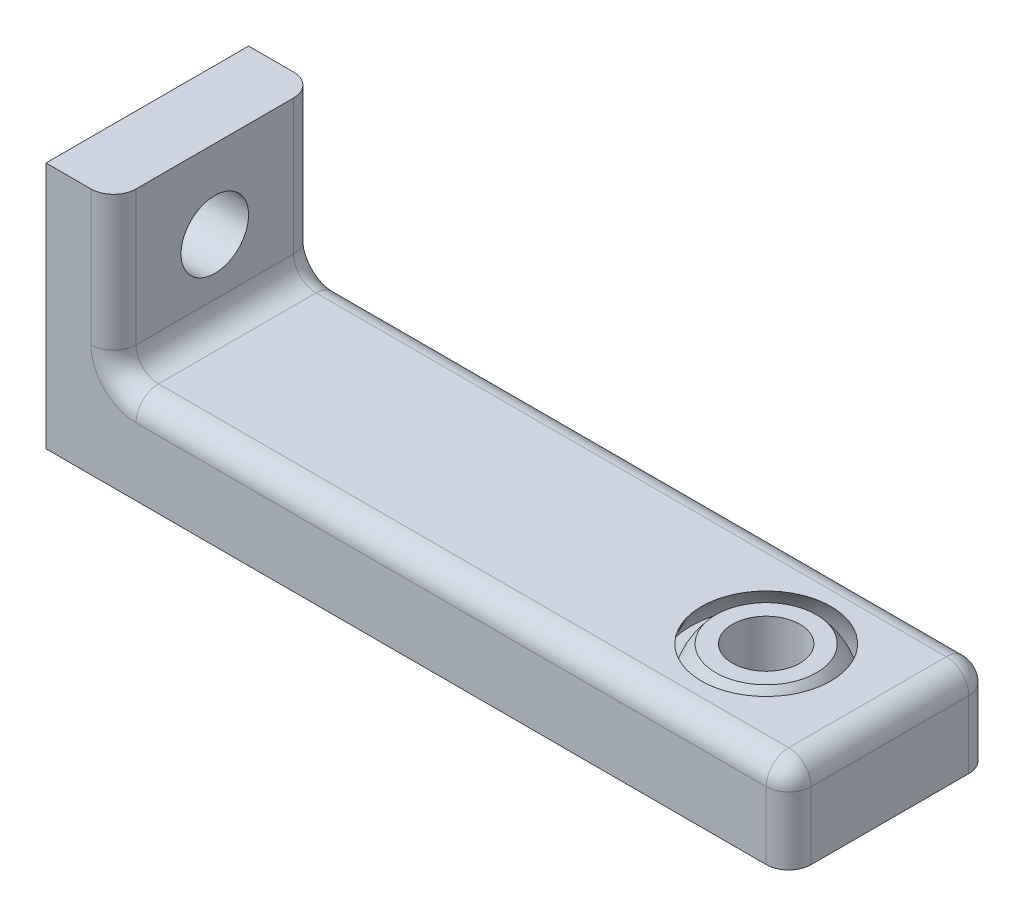
ISO-10303-21;
HEADER;
FILE_DESCRIPTION(('STEP AP214'),'2;1');
FILE_NAME('part.step','',(''),(''),'','','');
FILE_SCHEMA(('AUTOMOTIVE_DESIGN { 1 0 10303 214 1 1 1 1 }'));
ENDSEC;
DATA;
#1=APPLICATION_CONTEXT('core data for automotive mechanical design processes');
#2=APPLICATION_PROTOCOL_DEFINITION('international standard','automotive_design',2000,#1);
#3=PRODUCT_CONTEXT('',#1,'mechanical');
#4=PRODUCT('Part','Part','',(#3));
#5=PRODUCT_RELATED_PRODUCT_CATEGORY('part','',(#4));
#6=PRODUCT_DEFINITION_FORMATION('','',#4);
#7=PRODUCT_DEFINITION_CONTEXT('part definition',#1,'design');
#8=PRODUCT_DEFINITION('design','',#6,#7);
#9=PRODUCT_DEFINITION_SHAPE('','',#8);
#10=(LENGTH_UNIT() NAMED_UNIT(*) SI_UNIT(.MILLI.,.METRE.));
#11=(NAMED_UNIT(*) PLANE_ANGLE_UNIT() SI_UNIT($,.RADIAN.));
#12=(NAMED_UNIT(*) SI_UNIT($,.STERADIAN.) SOLID_ANGLE_UNIT());
#13=UNCERTAINTY_MEASURE_WITH_UNIT(LENGTH_MEASURE(1.E-05),#10,'distance_accuracy_value','');
#14=(GEOMETRIC_REPRESENTATION_CONTEXT(3) GLOBAL_UNCERTAINTY_ASSIGNED_CONTEXT((#13)) GLOBAL_UNIT_ASSIGNED_CONTEXT((#10,
#11,#12)) REPRESENTATION_CONTEXT('',''));
#15=CARTESIAN_POINT('',(0.,0.,0.));
#16=DIRECTION('',(0.,0.,1.));
#17=DIRECTION('',(1.,0.,0.));
#18=AXIS2_PLACEMENT_3D('',#15,#16,#17);
#19=CARTESIAN_POINT('',(-3.,0.,0.));
#20=DIRECTION('',(0.,0.,-1.));
#21=DIRECTION('',(1.,0.,0.));
#22=AXIS2_PLACEMENT_3D('',#19,#20,#21);
#23=SPHERICAL_SURFACE('',#22,3.);
#24=CARTESIAN_POINT('',(-3.,0.,0.));
#25=DIRECTION('',(0.,1.,0.));
#26=DIRECTION('',(0.,0.,1.));
#27=AXIS2_PLACEMENT_3D('',#24,#25,#26);
#28=SPHERICAL_SURFACE('',#27,3.);
#29=CARTESIAN_POINT('',(-3.,-2.,0.));
#30=DIRECTION('',(0.,1.,0.));
#31=DIRECTION('',(0.,0.,1.));
#32=AXIS2_PLACEMENT_3D('',#29,#30,#31);
#33=CIRCLE('',#32,2.23606797749979);
#34=CARTESIAN_POINT('',(-3.,-2.,2.23606797749979));
#35=VERTEX_POINT('',#34);
#36=EDGE_CURVE('E57',#35,#35,#33,.F.);
#37=ORIENTED_EDGE('',*,*,#36,.F.);
#38=EDGE_LOOP('',(#37));
#39=FACE_BOUND('',#38,.T.);
#40=CARTESIAN_POINT('',(-3.,2.,0.));
#41=DIRECTION('',(0.,-1.,0.));
#42=DIRECTION('',(0.,0.,-1.));
#43=AXIS2_PLACEMENT_3D('',#40,#41,#42);
#44=CIRCLE('',#43,2.23606797749979);
#45=CARTESIAN_POINT('',(-3.,2.,-2.23606797749979));
#46=VERTEX_POINT('',#45);
#47=EDGE_CURVE('E11',#46,#46,#44,.F.);
#48=ORIENTED_EDGE('',*,*,#47,.F.);
#49=EDGE_LOOP('',(#48));
#50=FACE_BOUND('',#49,.T.);
#51=ADVANCED_FACE('F45',(#39,#50),#28,.T.);
#52=CARTESIAN_POINT('',(-3.,10.,0.));
#53=DIRECTION('',(0.,-1.,0.));
#54=DIRECTION('',(0.,0.,-1.));
#55=AXIS2_PLACEMENT_3D('',#52,#53,#54);
#56=CYLINDRICAL_SURFACE('',#55,1.5);
#57=CARTESIAN_POINT('',(-3.,-2.,0.));
#58=DIRECTION('',(0.,1.,0.));
#59=DIRECTION('',(0.,0.,1.));
#60=AXIS2_PLACEMENT_3D('',#57,#58,#59);
#61=CIRCLE('',#60,1.5);
#62=CARTESIAN_POINT('',(-3.,-2.,1.5));
#63=VERTEX_POINT('',#62);
#64=EDGE_CURVE('E48',#63,#63,#61,.T.);
#65=ORIENTED_EDGE('',*,*,#64,.F.);
#66=EDGE_LOOP('',(#65));
#67=FACE_BOUND('',#66,.T.);
#68=CARTESIAN_POINT('',(-3.,2.,0.));
#69=DIRECTION('',(0.,-1.,0.));
#70=DIRECTION('',(0.,0.,-1.));
#71=AXIS2_PLACEMENT_3D('',#68,#69,#70);
#72=CIRCLE('',#71,1.5);
#73=CARTESIAN_POINT('',(-3.,2.,-1.5));
#74=VERTEX_POINT('',#73);
#75=EDGE_CURVE('E52',#74,#74,#72,.T.);
#76=ORIENTED_EDGE('',*,*,#75,.F.);
#77=EDGE_LOOP('',(#76));
#78=FACE_BOUND('',#77,.T.);
#79=ADVANCED_FACE('F67',(#67,#78),#56,.F.);
#80=CARTESIAN_POINT('',(15.5,2.,-4.5));
#81=DIRECTION('',(0.,-1.,0.));
#82=DIRECTION('',(0.,0.,-1.));
#83=AXIS2_PLACEMENT_3D('',#80,#81,#82);
#84=PLANE('',#83);
#85=ORIENTED_EDGE('',*,*,#47,.T.);
#86=EDGE_LOOP('',(#85));
#87=FACE_BOUND('',#86,.T.);
#88=ORIENTED_EDGE('',*,*,#75,.T.);
#89=EDGE_LOOP('',(#88));
#90=FACE_BOUND('',#89,.T.);
#91=ADVANCED_FACE('F70',(#87,#90),#84,.F.);
#92=CARTESIAN_POINT('',(15.5,-2.,-4.5));
#93=DIRECTION('',(0.,1.,0.));
#94=DIRECTION('',(0.,0.,1.));
#95=AXIS2_PLACEMENT_3D('',#92,#93,#94);
#96=PLANE('',#95);
#97=ORIENTED_EDGE('',*,*,#36,.T.);
#98=EDGE_LOOP('',(#97));
#99=FACE_BOUND('',#98,.T.);
#100=ORIENTED_EDGE('',*,*,#64,.T.);
#101=EDGE_LOOP('',(#100));
#102=FACE_BOUND('',#101,.T.);
#103=ADVANCED_FACE('F65',(#99,#102),#96,.F.);
#104=CLOSED_SHELL('',(#51,#79,#91,#103));
#105=MANIFOLD_SOLID_BREP('B2',#104);
#106=CARTESIAN_POINT('',(0.,2.,0.));
#107=DIRECTION('',(0.,-1.,0.));
#108=DIRECTION('',(0.,0.,-1.));
#109=AXIS2_PLACEMENT_3D('',#106,#107,#108);
#110=PLANE('',#109);
#111=CARTESIAN_POINT('',(-3.,2.,0.));
#112=DIRECTION('',(0.,-1.,0.));
#113=DIRECTION('',(0.,0.,-1.));
#114=AXIS2_PLACEMENT_3D('',#111,#112,#113);
#115=CIRCLE('',#114,2.87228132326901);
#116=CARTESIAN_POINT('',(-3.,2.,-2.87228132326901));
#117=VERTEX_POINT('',#116);
#118=EDGE_CURVE('E324',#117,#117,#115,.T.);
#119=ORIENTED_EDGE('',*,*,#118,.T.);
#120=EDGE_LOOP('',(#119));
#121=FACE_BOUND('',#120,.T.);
#122=DIRECTION('',(0.,0.,-1.));
#123=VECTOR('',#122,1.);
#124=CARTESIAN_POINT('',(-26.5,2.,4.5));
#125=LINE('',#124,#123);
#126=CARTESIAN_POINT('',(-26.5,2.,-3.5));
#127=VERTEX_POINT('',#126);
#128=CARTESIAN_POINT('',(-26.5,2.,3.5));
#129=VERTEX_POINT('',#128);
#130=EDGE_CURVE('E388',#127,#129,#125,.F.);
#131=ORIENTED_EDGE('',*,*,#130,.T.);
#132=DIRECTION('',(1.,0.,0.));
#133=VECTOR('',#132,1.);
#134=CARTESIAN_POINT('',(1.5,2.,3.5));
#135=LINE('',#134,#133);
#136=CARTESIAN_POINT('',(1.5,2.,3.5));
#137=VERTEX_POINT('',#136);
#138=EDGE_CURVE('E413',#129,#137,#135,.T.);
#139=ORIENTED_EDGE('',*,*,#138,.T.);
#140=DIRECTION('',(0.,0.,-1.));
#141=VECTOR('',#140,1.);
#142=CARTESIAN_POINT('',(1.5,2.,-3.5));
#143=LINE('',#142,#141);
#144=CARTESIAN_POINT('',(1.5,2.,-3.5));
#145=VERTEX_POINT('',#144);
#146=EDGE_CURVE('E411',#137,#145,#143,.T.);
#147=ORIENTED_EDGE('',*,*,#146,.T.);
#148=DIRECTION('',(-1.,0.,0.));
#149=VECTOR('',#148,1.);
#150=CARTESIAN_POINT('',(-26.5,2.,-3.5));
#151=LINE('',#150,#149);
#152=EDGE_CURVE('E409',#145,#127,#151,.T.);
#153=ORIENTED_EDGE('',*,*,#152,.T.);
#154=EDGE_LOOP('',(#131,#139,#147,#153));
#155=FACE_BOUND('',#154,.T.);
#156=ADVANCED_FACE('F107',(#121,#155),#110,.F.);
#157=CARTESIAN_POINT('',(0.,-2.,0.));
#158=DIRECTION('',(0.,-1.,0.));
#159=DIRECTION('',(0.,0.,-1.));
#160=AXIS2_PLACEMENT_3D('',#157,#158,#159);
#161=PLANE('',#160);
#162=CARTESIAN_POINT('',(-3.,-2.,0.));
#163=DIRECTION('',(0.,-1.,0.));
#164=DIRECTION('',(0.,0.,-1.));
#165=AXIS2_PLACEMENT_3D('',#162,#163,#164);
#166=CIRCLE('',#165,2.87228132326901);
#167=CARTESIAN_POINT('',(-3.,-2.,-2.87228132326901));
#168=VERTEX_POINT('',#167);
#169=EDGE_CURVE('E337',#168,#168,#166,.T.);
#170=ORIENTED_EDGE('',*,*,#169,.F.);
#171=EDGE_LOOP('',(#170));
#172=FACE_BOUND('',#171,.T.);
#173=DIRECTION('',(0.,0.,-1.));
#174=VECTOR('',#173,1.);
#175=CARTESIAN_POINT('',(2.5,-2.,-4.5));
#176=LINE('',#175,#174);
#177=CARTESIAN_POINT('',(2.5,-2.,3.5));
#178=VERTEX_POINT('',#177);
#179=CARTESIAN_POINT('',(2.5,-2.,-3.5));
#180=VERTEX_POINT('',#179);
#181=EDGE_CURVE('E340',#178,#180,#176,.T.);
#182=ORIENTED_EDGE('',*,*,#181,.F.);
#183=CARTESIAN_POINT('',(1.5,-2.,3.5));
#184=DIRECTION('',(0.,-1.,0.));
#185=DIRECTION('',(0.,0.,-1.));
#186=AXIS2_PLACEMENT_3D('',#183,#184,#185);
#187=CIRCLE('',#186,1.);
#188=CARTESIAN_POINT('',(1.5,-2.,4.5));
#189=VERTEX_POINT('',#188);
#190=EDGE_CURVE('E383',#178,#189,#187,.T.);
#191=ORIENTED_EDGE('',*,*,#190,.T.);
#192=DIRECTION('',(1.,0.,0.));
#193=VECTOR('',#192,1.);
#194=CARTESIAN_POINT('',(2.5,-2.,4.5));
#195=LINE('',#194,#193);
#196=CARTESIAN_POINT('',(-30.5,-2.,4.5));
#197=VERTEX_POINT('',#196);
#198=EDGE_CURVE('E345',#197,#189,#195,.T.);
#199=ORIENTED_EDGE('',*,*,#198,.F.);
#200=DIRECTION('',(0.,0.,1.));
#201=VECTOR('',#200,1.);
#202=CARTESIAN_POINT('',(-30.5,-2.,-4.5));
#203=LINE('',#202,#201);
#204=CARTESIAN_POINT('',(-30.5,-2.,-4.5));
#205=VERTEX_POINT('',#204);
#206=EDGE_CURVE('E268',#205,#197,#203,.T.);
#207=ORIENTED_EDGE('',*,*,#206,.F.);
#208=DIRECTION('',(-1.,0.,0.));
#209=VECTOR('',#208,1.);
#210=CARTESIAN_POINT('',(2.5,-2.,-4.5));
#211=LINE('',#210,#209);
#212=CARTESIAN_POINT('',(1.5,-2.,-4.5));
#213=VERTEX_POINT('',#212);
#214=EDGE_CURVE('E342',#213,#205,#211,.T.);
#215=ORIENTED_EDGE('',*,*,#214,.F.);
#216=CARTESIAN_POINT('',(1.5,-2.,-3.5));
#217=DIRECTION('',(0.,-1.,0.));
#218=DIRECTION('',(0.,0.,-1.));
#219=AXIS2_PLACEMENT_3D('',#216,#217,#218);
#220=CIRCLE('',#219,1.);
#221=EDGE_CURVE('E375',#213,#180,#220,.T.);
#222=ORIENTED_EDGE('',*,*,#221,.T.);
#223=EDGE_LOOP('',(#182,#191,#199,#207,#215,#222));
#224=FACE_BOUND('',#223,.T.);
#225=ADVANCED_FACE('F506',(#172,#224),#161,.T.);
#226=CARTESIAN_POINT('',(2.5,-2.,-4.5));
#227=DIRECTION('',(1.,0.,0.));
#228=DIRECTION('',(0.,0.,-1.));
#229=AXIS2_PLACEMENT_3D('',#226,#227,#228);
#230=PLANE('',#229);
#231=DIRECTION('',(0.,1.,0.));
#232=VECTOR('',#231,1.);
#233=CARTESIAN_POINT('',(2.5,-2.,-3.5));
#234=LINE('',#233,#232);
#235=CARTESIAN_POINT('',(2.5,1.,-3.5));
#236=VERTEX_POINT('',#235);
#237=EDGE_CURVE('E370',#180,#236,#234,.T.);
#238=ORIENTED_EDGE('',*,*,#237,.T.);
#239=DIRECTION('',(0.,0.,-1.));
#240=VECTOR('',#239,1.);
#241=CARTESIAN_POINT('',(2.5,1.,3.5));
#242=LINE('',#241,#240);
#243=CARTESIAN_POINT('',(2.5,1.,3.5));
#244=VERTEX_POINT('',#243);
#245=EDGE_CURVE('E417',#236,#244,#242,.F.);
#246=ORIENTED_EDGE('',*,*,#245,.T.);
#247=DIRECTION('',(0.,1.,0.));
#248=VECTOR('',#247,1.);
#249=CARTESIAN_POINT('',(2.5,-2.,3.5));
#250=LINE('',#249,#248);
#251=EDGE_CURVE('E381',#244,#178,#250,.F.);
#252=ORIENTED_EDGE('',*,*,#251,.T.);
#253=ORIENTED_EDGE('',*,*,#181,.T.);
#254=EDGE_LOOP('',(#238,#246,#252,#253));
#255=FACE_BOUND('',#254,.T.);
#256=ADVANCED_FACE('F500',(#255),#230,.T.);
#257=CARTESIAN_POINT('',(2.5,-2.,4.5));
#258=DIRECTION('',(0.,0.,1.));
#259=DIRECTION('',(1.,0.,0.));
#260=AXIS2_PLACEMENT_3D('',#257,#258,#259);
#261=PLANE('',#260);
#262=CARTESIAN_POINT('',(-26.5,3.,4.5));
#263=DIRECTION('',(0.,0.,1.));
#264=DIRECTION('',(1.,0.,0.));
#265=AXIS2_PLACEMENT_3D('',#262,#263,#264);
#266=CIRCLE('',#265,2.);
#267=CARTESIAN_POINT('',(-26.5,1.,4.5));
#268=VERTEX_POINT('',#267);
#269=CARTESIAN_POINT('',(-28.5,3.,4.5));
#270=VERTEX_POINT('',#269);
#271=EDGE_CURVE('E398',#268,#270,#266,.F.);
#272=ORIENTED_EDGE('',*,*,#271,.T.);
#273=DIRECTION('',(0.,-1.,0.));
#274=VECTOR('',#273,1.);
#275=CARTESIAN_POINT('',(-28.5,9.,4.5));
#276=LINE('',#275,#274);
#277=CARTESIAN_POINT('',(-28.5,9.,4.5));
#278=VERTEX_POINT('',#277);
#279=EDGE_CURVE('E279',#270,#278,#276,.F.);
#280=ORIENTED_EDGE('',*,*,#279,.T.);
#281=DIRECTION('',(1.,0.,0.));
#282=VECTOR('',#281,1.);
#283=CARTESIAN_POINT('',(-30.5,9.,4.5));
#284=LINE('',#283,#282);
#285=CARTESIAN_POINT('',(-30.5,9.,4.5));
#286=VERTEX_POINT('',#285);
#287=EDGE_CURVE('E276',#286,#278,#284,.T.);
#288=ORIENTED_EDGE('',*,*,#287,.F.);
#289=DIRECTION('',(0.,1.,0.));
#290=VECTOR('',#289,1.);
#291=CARTESIAN_POINT('',(-30.5,-2.,4.5));
#292=LINE('',#291,#290);
#293=EDGE_CURVE('E261',#197,#286,#292,.T.);
#294=ORIENTED_EDGE('',*,*,#293,.F.);
#295=ORIENTED_EDGE('',*,*,#198,.T.);
#296=DIRECTION('',(0.,1.,0.));
#297=VECTOR('',#296,1.);
#298=CARTESIAN_POINT('',(1.5,-2.,4.5));
#299=LINE('',#298,#297);
#300=CARTESIAN_POINT('',(1.5,1.,4.5));
#301=VERTEX_POINT('',#300);
#302=EDGE_CURVE('E378',#189,#301,#299,.T.);
#303=ORIENTED_EDGE('',*,*,#302,.T.);
#304=DIRECTION('',(1.,0.,0.));
#305=VECTOR('',#304,1.);
#306=CARTESIAN_POINT('',(-26.5,1.,4.5));
#307=LINE('',#306,#305);
#308=EDGE_CURVE('E396',#301,#268,#307,.F.);
#309=ORIENTED_EDGE('',*,*,#308,.T.);
#310=EDGE_LOOP('',(#272,#280,#288,#294,#295,#303,#309));
#311=FACE_BOUND('',#310,.T.);
#312=ADVANCED_FACE('F277',(#311),#261,.T.);
#313=CARTESIAN_POINT('',(-30.5,-2.,-4.5));
#314=DIRECTION('',(-1.,0.,0.));
#315=DIRECTION('',(0.,0.,1.));
#316=AXIS2_PLACEMENT_3D('',#313,#314,#315);
#317=PLANE('',#316);
#318=CARTESIAN_POINT('',(-30.5,5.5,0.));
#319=DIRECTION('',(-1.,0.,0.));
#320=DIRECTION('',(0.,0.,1.));
#321=AXIS2_PLACEMENT_3D('',#318,#319,#320);
#322=CIRCLE('',#321,1.5);
#323=CARTESIAN_POINT('',(-30.5,5.5,1.50000000000001));
#324=VERTEX_POINT('',#323);
#325=EDGE_CURVE('E287',#324,#324,#322,.T.);
#326=ORIENTED_EDGE('',*,*,#325,.F.);
#327=EDGE_LOOP('',(#326));
#328=FACE_BOUND('',#327,.T.);
#329=DIRECTION('',(0.,1.,0.));
#330=VECTOR('',#329,1.);
#331=CARTESIAN_POINT('',(-30.5,1.,2.75));
#332=LINE('',#331,#330);
#333=CARTESIAN_POINT('',(-30.5,-1.,2.75));
#334=VERTEX_POINT('',#333);
#335=CARTESIAN_POINT('',(-30.5,1.,2.75));
#336=VERTEX_POINT('',#335);
#337=EDGE_CURVE('E297',#334,#336,#332,.T.);
#338=ORIENTED_EDGE('',*,*,#337,.F.);
#339=DIRECTION('',(0.,0.,1.));
#340=VECTOR('',#339,1.);
#341=CARTESIAN_POINT('',(-30.5,-1.,-2.75));
#342=LINE('',#341,#340);
#343=CARTESIAN_POINT('',(-30.5,-1.,-2.75));
#344=VERTEX_POINT('',#343);
#345=EDGE_CURVE('E302',#344,#334,#342,.T.);
#346=ORIENTED_EDGE('',*,*,#345,.F.);
#347=DIRECTION('',(0.,-1.,0.));
#348=VECTOR('',#347,1.);
#349=CARTESIAN_POINT('',(-30.5,1.,-2.75));
#350=LINE('',#349,#348);
#351=CARTESIAN_POINT('',(-30.5,1.,-2.75));
#352=VERTEX_POINT('',#351);
#353=EDGE_CURVE('E316',#352,#344,#350,.T.);
#354=ORIENTED_EDGE('',*,*,#353,.F.);
#355=DIRECTION('',(0.,0.,-1.));
#356=VECTOR('',#355,1.);
#357=CARTESIAN_POINT('',(-30.5,1.,-2.75));
#358=LINE('',#357,#356);
#359=EDGE_CURVE('E313',#336,#352,#358,.T.);
#360=ORIENTED_EDGE('',*,*,#359,.F.);
#361=EDGE_LOOP('',(#338,#346,#354,#360));
#362=FACE_BOUND('',#361,.T.);
#363=ORIENTED_EDGE('',*,*,#293,.T.);
#364=DIRECTION('',(0.,0.,1.));
#365=VECTOR('',#364,1.);
#366=CARTESIAN_POINT('',(-30.5,9.,-4.5));
#367=LINE('',#366,#365);
#368=CARTESIAN_POINT('',(-30.5,9.,-4.5));
#369=VERTEX_POINT('',#368);
#370=EDGE_CURVE('E266',#369,#286,#367,.T.);
#371=ORIENTED_EDGE('',*,*,#370,.F.);
#372=DIRECTION('',(0.,1.,0.));
#373=VECTOR('',#372,1.);
#374=CARTESIAN_POINT('',(-30.5,-2.,-4.5));
#375=LINE('',#374,#373);
#376=EDGE_CURVE('E273',#205,#369,#375,.T.);
#377=ORIENTED_EDGE('',*,*,#376,.F.);
#378=ORIENTED_EDGE('',*,*,#206,.T.);
#379=EDGE_LOOP('',(#363,#371,#377,#378));
#380=FACE_BOUND('',#379,.T.);
#381=ADVANCED_FACE('F263',(#328,#362,#380),#317,.T.);
#382=CARTESIAN_POINT('',(2.5,-2.,-4.5));
#383=DIRECTION('',(0.,0.,-1.));
#384=DIRECTION('',(-1.,0.,0.));
#385=AXIS2_PLACEMENT_3D('',#382,#383,#384);
#386=PLANE('',#385);
#387=DIRECTION('',(-1.,0.,0.));
#388=VECTOR('',#387,1.);
#389=CARTESIAN_POINT('',(-30.5,9.,-4.5));
#390=LINE('',#389,#388);
#391=CARTESIAN_POINT('',(-28.5,9.,-4.5));
#392=VERTEX_POINT('',#391);
#393=EDGE_CURVE('E285',#392,#369,#390,.T.);
#394=ORIENTED_EDGE('',*,*,#393,.F.);
#395=DIRECTION('',(0.,-1.,0.));
#396=VECTOR('',#395,1.);
#397=CARTESIAN_POINT('',(-28.5,3.,-4.5));
#398=LINE('',#397,#396);
#399=CARTESIAN_POINT('',(-28.5,3.,-4.5));
#400=VERTEX_POINT('',#399);
#401=EDGE_CURVE('E43',#392,#400,#398,.T.);
#402=ORIENTED_EDGE('',*,*,#401,.T.);
#403=CARTESIAN_POINT('',(-26.5,3.,-4.5));
#404=DIRECTION('',(0.,0.,-1.));
#405=DIRECTION('',(-1.,0.,0.));
#406=AXIS2_PLACEMENT_3D('',#403,#404,#405);
#407=CIRCLE('',#406,2.);
#408=CARTESIAN_POINT('',(-26.5,1.,-4.5));
#409=VERTEX_POINT('',#408);
#410=EDGE_CURVE('E116',#400,#409,#407,.F.);
#411=ORIENTED_EDGE('',*,*,#410,.T.);
#412=DIRECTION('',(-1.,0.,0.));
#413=VECTOR('',#412,1.);
#414=CARTESIAN_POINT('',(1.5,1.,-4.5));
#415=LINE('',#414,#413);
#416=CARTESIAN_POINT('',(1.5,1.,-4.5));
#417=VERTEX_POINT('',#416);
#418=EDGE_CURVE('E421',#409,#417,#415,.F.);
#419=ORIENTED_EDGE('',*,*,#418,.T.);
#420=DIRECTION('',(0.,1.,0.));
#421=VECTOR('',#420,1.);
#422=CARTESIAN_POINT('',(1.5,-2.,-4.5));
#423=LINE('',#422,#421);
#424=EDGE_CURVE('E373',#417,#213,#423,.F.);
#425=ORIENTED_EDGE('',*,*,#424,.T.);
#426=ORIENTED_EDGE('',*,*,#214,.T.);
#427=ORIENTED_EDGE('',*,*,#376,.T.);
#428=EDGE_LOOP('',(#394,#402,#411,#419,#425,#426,#427));
#429=FACE_BOUND('',#428,.T.);
#430=ADVANCED_FACE('F507',(#429),#386,.T.);
#431=CARTESIAN_POINT('',(-3.,0.,0.));
#432=DIRECTION('',(0.,0.,-1.));
#433=DIRECTION('',(1.,0.,0.));
#434=AXIS2_PLACEMENT_3D('',#431,#432,#433);
#435=SPHERICAL_SURFACE('',#434,3.5);
#436=CARTESIAN_POINT('',(-3.,-1.,0.));
#437=DIRECTION('',(0.,-1.,0.));
#438=DIRECTION('',(0.,0.,-1.));
#439=AXIS2_PLACEMENT_3D('',#436,#437,#438);
#440=CIRCLE('',#439,3.35410196624968);
#441=CARTESIAN_POINT('',(-4.92028643696715,-1.,-2.75));
#442=VERTEX_POINT('',#441);
#443=CARTESIAN_POINT('',(-4.92028643696715,-1.,2.75));
#444=VERTEX_POINT('',#443);
#445=EDGE_CURVE('E361',#442,#444,#440,.F.);
#446=ORIENTED_EDGE('',*,*,#445,.T.);
#447=CARTESIAN_POINT('',(-3.,0.,2.75));
#448=DIRECTION('',(0.,0.,1.));
#449=DIRECTION('',(0.,-1.,0.));
#450=AXIS2_PLACEMENT_3D('',#447,#448,#449);
#451=CIRCLE('',#450,2.1650635094611);
#452=CARTESIAN_POINT('',(-4.92028643696715,1.,2.75));
#453=VERTEX_POINT('',#452);
#454=EDGE_CURVE('E365',#444,#453,#451,.F.);
#455=ORIENTED_EDGE('',*,*,#454,.T.);
#456=CARTESIAN_POINT('',(-3.,1.,0.));
#457=DIRECTION('',(0.,1.,0.));
#458=DIRECTION('',(0.,0.,1.));
#459=AXIS2_PLACEMENT_3D('',#456,#457,#458);
#460=CIRCLE('',#459,3.35410196624968);
#461=CARTESIAN_POINT('',(-4.92028643696715,1.,-2.75));
#462=VERTEX_POINT('',#461);
#463=EDGE_CURVE('E356',#453,#462,#460,.F.);
#464=ORIENTED_EDGE('',*,*,#463,.T.);
#465=CARTESIAN_POINT('',(-3.,0.,-2.75));
#466=DIRECTION('',(0.,0.,-1.));
#467=DIRECTION('',(-1.,0.,0.));
#468=AXIS2_PLACEMENT_3D('',#465,#466,#467);
#469=CIRCLE('',#468,2.1650635094611);
#470=EDGE_CURVE('E369',#462,#442,#469,.F.);
#471=ORIENTED_EDGE('',*,*,#470,.T.);
#472=EDGE_LOOP('',(#446,#455,#464,#471));
#473=FACE_BOUND('',#472,.T.);
#474=CARTESIAN_POINT('',(-0.5,0.,0.));
#475=DIRECTION('',(-1.,0.,0.));
#476=DIRECTION('',(0.,0.,1.));
#477=AXIS2_PLACEMENT_3D('',#474,#475,#476);
#478=CIRCLE('',#477,2.44948974278318);
#479=CARTESIAN_POINT('',(-0.5,-1.,-2.23606797749979));
#480=VERTEX_POINT('',#479);
#481=CARTESIAN_POINT('',(-0.5,1.,-2.23606797749979));
#482=VERTEX_POINT('',#481);
#483=EDGE_CURVE('E352',#480,#482,#478,.F.);
#484=ORIENTED_EDGE('',*,*,#483,.F.);
#485=CARTESIAN_POINT('',(-1.07971356303285,-1.,-2.75));
#486=VERTEX_POINT('',#485);
#487=EDGE_CURVE('E362',#480,#486,#440,.F.);
#488=ORIENTED_EDGE('',*,*,#487,.T.);
#489=CARTESIAN_POINT('',(-1.07971356303285,1.,-2.75));
#490=VERTEX_POINT('',#489);
#491=EDGE_CURVE('E366',#486,#490,#469,.F.);
#492=ORIENTED_EDGE('',*,*,#491,.T.);
#493=EDGE_CURVE('E357',#490,#482,#460,.F.);
#494=ORIENTED_EDGE('',*,*,#493,.T.);
#495=EDGE_LOOP('',(#484,#488,#492,#494));
#496=FACE_BOUND('',#495,.T.);
#497=CARTESIAN_POINT('',(-0.5,1.,2.23606797749979));
#498=VERTEX_POINT('',#497);
#499=CARTESIAN_POINT('',(-1.07971356303285,1.,2.75));
#500=VERTEX_POINT('',#499);
#501=EDGE_CURVE('E351',#498,#500,#460,.F.);
#502=ORIENTED_EDGE('',*,*,#501,.T.);
#503=CARTESIAN_POINT('',(-1.07971356303285,-1.,2.75));
#504=VERTEX_POINT('',#503);
#505=EDGE_CURVE('E360',#500,#504,#451,.F.);
#506=ORIENTED_EDGE('',*,*,#505,.T.);
#507=CARTESIAN_POINT('',(-0.5,-1.,2.23606797749979));
#508=VERTEX_POINT('',#507);
#509=EDGE_CURVE('E355',#504,#508,#440,.F.);
#510=ORIENTED_EDGE('',*,*,#509,.T.);
#511=EDGE_CURVE('E272',#498,#508,#478,.F.);
#512=ORIENTED_EDGE('',*,*,#511,.F.);
#513=EDGE_LOOP('',(#502,#506,#510,#512));
#514=FACE_BOUND('',#513,.T.);
#515=ORIENTED_EDGE('',*,*,#169,.T.);
#516=EDGE_LOOP('',(#515));
#517=FACE_BOUND('',#516,.T.);
#518=ORIENTED_EDGE('',*,*,#118,.F.);
#519=EDGE_LOOP('',(#518));
#520=FACE_BOUND('',#519,.T.);
#521=ADVANCED_FACE('F525',(#473,#496,#514,#517,#520),#435,.F.);
#522=CARTESIAN_POINT('',(-0.5,0.,0.));
#523=DIRECTION('',(-1.,0.,0.));
#524=DIRECTION('',(0.,0.,1.));
#525=AXIS2_PLACEMENT_3D('',#522,#523,#524);
#526=PLANE('',#525);
#527=ORIENTED_EDGE('',*,*,#511,.T.);
#528=DIRECTION('',(0.,0.,1.));
#529=VECTOR('',#528,1.);
#530=CARTESIAN_POINT('',(-0.5,-1.,-2.75));
#531=LINE('',#530,#529);
#532=CARTESIAN_POINT('',(-0.5,-1.,2.75));
#533=VERTEX_POINT('',#532);
#534=EDGE_CURVE('E308',#508,#533,#531,.T.);
#535=ORIENTED_EDGE('',*,*,#534,.T.);
#536=DIRECTION('',(0.,1.,0.));
#537=VECTOR('',#536,1.);
#538=CARTESIAN_POINT('',(-0.5,1.,2.75));
#539=LINE('',#538,#537);
#540=CARTESIAN_POINT('',(-0.5,1.,2.75));
#541=VERTEX_POINT('',#540);
#542=EDGE_CURVE('E298',#533,#541,#539,.T.);
#543=ORIENTED_EDGE('',*,*,#542,.T.);
#544=DIRECTION('',(0.,0.,-1.));
#545=VECTOR('',#544,1.);
#546=CARTESIAN_POINT('',(-0.5,1.,-2.75));
#547=LINE('',#546,#545);
#548=EDGE_CURVE('E303',#541,#498,#547,.T.);
#549=ORIENTED_EDGE('',*,*,#548,.T.);
#550=EDGE_LOOP('',(#527,#535,#543,#549));
#551=FACE_BOUND('',#550,.T.);
#552=ADVANCED_FACE('F752',(#551),#526,.T.);
#553=CARTESIAN_POINT('',(-0.5,1.,-2.75));
#554=DIRECTION('',(0.,1.,0.));
#555=DIRECTION('',(0.,0.,1.));
#556=AXIS2_PLACEMENT_3D('',#553,#554,#555);
#557=PLANE('',#556);
#558=ORIENTED_EDGE('',*,*,#548,.F.);
#559=DIRECTION('',(-1.,0.,0.));
#560=VECTOR('',#559,1.);
#561=CARTESIAN_POINT('',(-0.5,1.,2.75));
#562=LINE('',#561,#560);
#563=EDGE_CURVE('E334',#541,#500,#562,.T.);
#564=ORIENTED_EDGE('',*,*,#563,.T.);
#565=ORIENTED_EDGE('',*,*,#501,.F.);
#566=EDGE_LOOP('',(#558,#564,#565));
#567=FACE_BOUND('',#566,.T.);
#568=ADVANCED_FACE('F692',(#567),#557,.F.);
#569=CARTESIAN_POINT('',(-0.5,-1.,-2.75));
#570=DIRECTION('',(0.,-1.,0.));
#571=DIRECTION('',(0.,0.,-1.));
#572=AXIS2_PLACEMENT_3D('',#569,#570,#571);
#573=PLANE('',#572);
#574=DIRECTION('',(-1.,0.,0.));
#575=VECTOR('',#574,1.);
#576=CARTESIAN_POINT('',(-0.5,-1.,2.75));
#577=LINE('',#576,#575);
#578=EDGE_CURVE('E321',#533,#504,#577,.T.);
#579=ORIENTED_EDGE('',*,*,#578,.F.);
#580=ORIENTED_EDGE('',*,*,#534,.F.);
#581=ORIENTED_EDGE('',*,*,#509,.F.);
#582=EDGE_LOOP('',(#579,#580,#581));
#583=FACE_BOUND('',#582,.T.);
#584=ADVANCED_FACE('F712',(#583),#573,.F.);
#585=CARTESIAN_POINT('',(-0.5,1.,2.75));
#586=DIRECTION('',(0.,0.,1.));
#587=DIRECTION('',(0.,-1.,0.));
#588=AXIS2_PLACEMENT_3D('',#585,#586,#587);
#589=PLANE('',#588);
#590=ORIENTED_EDGE('',*,*,#563,.F.);
#591=ORIENTED_EDGE('',*,*,#542,.F.);
#592=ORIENTED_EDGE('',*,*,#578,.T.);
#593=ORIENTED_EDGE('',*,*,#505,.F.);
#594=EDGE_LOOP('',(#590,#591,#592,#593));
#595=FACE_BOUND('',#594,.T.);
#596=ADVANCED_FACE('F721',(#595),#589,.F.);
#597=ORIENTED_EDGE('',*,*,#483,.T.);
#598=CARTESIAN_POINT('',(-0.5,1.,-2.75));
#599=VERTEX_POINT('',#598);
#600=EDGE_CURVE('E301',#482,#599,#547,.T.);
#601=ORIENTED_EDGE('',*,*,#600,.T.);
#602=DIRECTION('',(0.,-1.,0.));
#603=VECTOR('',#602,1.);
#604=CARTESIAN_POINT('',(-0.5,1.,-2.75));
#605=LINE('',#604,#603);
#606=CARTESIAN_POINT('',(-0.5,-1.,-2.75));
#607=VERTEX_POINT('',#606);
#608=EDGE_CURVE('E305',#599,#607,#605,.T.);
#609=ORIENTED_EDGE('',*,*,#608,.T.);
#610=EDGE_CURVE('E309',#607,#480,#531,.T.);
#611=ORIENTED_EDGE('',*,*,#610,.T.);
#612=EDGE_LOOP('',(#597,#601,#609,#611));
#613=FACE_BOUND('',#612,.T.);
#614=ADVANCED_FACE('F742',(#613),#526,.T.);
#615=DIRECTION('',(-1.,0.,0.));
#616=VECTOR('',#615,1.);
#617=CARTESIAN_POINT('',(-0.5,1.,-2.75));
#618=LINE('',#617,#616);
#619=EDGE_CURVE('E330',#599,#490,#618,.T.);
#620=ORIENTED_EDGE('',*,*,#619,.F.);
#621=ORIENTED_EDGE('',*,*,#600,.F.);
#622=ORIENTED_EDGE('',*,*,#493,.F.);
#623=EDGE_LOOP('',(#620,#621,#622));
#624=FACE_BOUND('',#623,.T.);
#625=ADVANCED_FACE('F691',(#624),#557,.F.);
#626=CARTESIAN_POINT('',(-0.5,1.,-2.75));
#627=DIRECTION('',(0.,0.,-1.));
#628=DIRECTION('',(-1.,0.,0.));
#629=AXIS2_PLACEMENT_3D('',#626,#627,#628);
#630=PLANE('',#629);
#631=DIRECTION('',(-1.,0.,0.));
#632=VECTOR('',#631,1.);
#633=CARTESIAN_POINT('',(-0.5,-1.,-2.75));
#634=LINE('',#633,#632);
#635=EDGE_CURVE('E326',#607,#486,#634,.T.);
#636=ORIENTED_EDGE('',*,*,#635,.F.);
#637=ORIENTED_EDGE('',*,*,#608,.F.);
#638=ORIENTED_EDGE('',*,*,#619,.T.);
#639=ORIENTED_EDGE('',*,*,#491,.F.);
#640=EDGE_LOOP('',(#636,#637,#638,#639));
#641=FACE_BOUND('',#640,.T.);
#642=ADVANCED_FACE('F702',(#641),#630,.F.);
#643=ORIENTED_EDGE('',*,*,#610,.F.);
#644=ORIENTED_EDGE('',*,*,#635,.T.);
#645=ORIENTED_EDGE('',*,*,#487,.F.);
#646=EDGE_LOOP('',(#643,#644,#645));
#647=FACE_BOUND('',#646,.T.);
#648=ADVANCED_FACE('F713',(#647),#573,.F.);
#649=EDGE_CURVE('E325',#444,#334,#577,.T.);
#650=ORIENTED_EDGE('',*,*,#649,.T.);
#651=ORIENTED_EDGE('',*,*,#337,.T.);
#652=EDGE_CURVE('E311',#453,#336,#562,.T.);
#653=ORIENTED_EDGE('',*,*,#652,.F.);
#654=ORIENTED_EDGE('',*,*,#454,.F.);
#655=EDGE_LOOP('',(#650,#651,#653,#654));
#656=FACE_BOUND('',#655,.T.);
#657=ADVANCED_FACE('F709',(#656),#589,.F.);
#658=EDGE_CURVE('E329',#442,#344,#634,.T.);
#659=ORIENTED_EDGE('',*,*,#658,.T.);
#660=ORIENTED_EDGE('',*,*,#345,.T.);
#661=ORIENTED_EDGE('',*,*,#649,.F.);
#662=ORIENTED_EDGE('',*,*,#445,.F.);
#663=EDGE_LOOP('',(#659,#660,#661,#662));
#664=FACE_BOUND('',#663,.T.);
#665=ADVANCED_FACE('F699',(#664),#573,.F.);
#666=EDGE_CURVE('E333',#462,#352,#618,.T.);
#667=ORIENTED_EDGE('',*,*,#666,.T.);
#668=ORIENTED_EDGE('',*,*,#353,.T.);
#669=ORIENTED_EDGE('',*,*,#658,.F.);
#670=ORIENTED_EDGE('',*,*,#470,.F.);
#671=EDGE_LOOP('',(#667,#668,#669,#670));
#672=FACE_BOUND('',#671,.T.);
#673=ADVANCED_FACE('F688',(#672),#630,.F.);
#674=ORIENTED_EDGE('',*,*,#652,.T.);
#675=ORIENTED_EDGE('',*,*,#359,.T.);
#676=ORIENTED_EDGE('',*,*,#666,.F.);
#677=ORIENTED_EDGE('',*,*,#463,.F.);
#678=EDGE_LOOP('',(#674,#675,#676,#677));
#679=FACE_BOUND('',#678,.T.);
#680=ADVANCED_FACE('F456',(#679),#557,.F.);
#681=CARTESIAN_POINT('',(-27.5,9.,-4.5));
#682=DIRECTION('',(-1.,0.,0.));
#683=DIRECTION('',(0.,0.,1.));
#684=AXIS2_PLACEMENT_3D('',#681,#682,#683);
#685=PLANE('',#684);
#686=CARTESIAN_POINT('',(-27.5,5.5,0.));
#687=DIRECTION('',(1.,0.,0.));
#688=DIRECTION('',(0.,0.,-1.));
#689=AXIS2_PLACEMENT_3D('',#686,#687,#688);
#690=CIRCLE('',#689,1.5);
#691=CARTESIAN_POINT('',(-27.5,5.5,-1.49999999999999));
#692=VERTEX_POINT('',#691);
#693=EDGE_CURVE('E290',#692,#692,#690,.T.);
#694=ORIENTED_EDGE('',*,*,#693,.F.);
#695=EDGE_LOOP('',(#694));
#696=FACE_BOUND('',#695,.T.);
#697=DIRECTION('',(0.,0.,-1.));
#698=VECTOR('',#697,1.);
#699=CARTESIAN_POINT('',(-27.5,9.,-4.5));
#700=LINE('',#699,#698);
#701=CARTESIAN_POINT('',(-27.5,9.,3.5));
#702=VERTEX_POINT('',#701);
#703=CARTESIAN_POINT('',(-27.5,9.,-3.5));
#704=VERTEX_POINT('',#703);
#705=EDGE_CURVE('E282',#702,#704,#700,.T.);
#706=ORIENTED_EDGE('',*,*,#705,.F.);
#707=DIRECTION('',(0.,-1.,0.));
#708=VECTOR('',#707,1.);
#709=CARTESIAN_POINT('',(-27.5,3.,3.5));
#710=LINE('',#709,#708);
#711=CARTESIAN_POINT('',(-27.5,3.,3.5));
#712=VERTEX_POINT('',#711);
#713=EDGE_CURVE('E393',#702,#712,#710,.T.);
#714=ORIENTED_EDGE('',*,*,#713,.T.);
#715=DIRECTION('',(0.,0.,-1.));
#716=VECTOR('',#715,1.);
#717=CARTESIAN_POINT('',(-27.5,3.,-4.5));
#718=LINE('',#717,#716);
#719=CARTESIAN_POINT('',(-27.5,3.,-3.5));
#720=VERTEX_POINT('',#719);
#721=EDGE_CURVE('E385',#712,#720,#718,.T.);
#722=ORIENTED_EDGE('',*,*,#721,.T.);
#723=DIRECTION('',(0.,-1.,0.));
#724=VECTOR('',#723,1.);
#725=CARTESIAN_POINT('',(-27.5,9.,-3.5));
#726=LINE('',#725,#724);
#727=EDGE_CURVE('E391',#720,#704,#726,.F.);
#728=ORIENTED_EDGE('',*,*,#727,.T.);
#729=EDGE_LOOP('',(#706,#714,#722,#728));
#730=FACE_BOUND('',#729,.T.);
#731=ADVANCED_FACE('F453',(#696,#730),#685,.F.);
#732=CARTESIAN_POINT('',(0.,9.,0.));
#733=DIRECTION('',(0.,1.,0.));
#734=DIRECTION('',(0.,0.,1.));
#735=AXIS2_PLACEMENT_3D('',#732,#733,#734);
#736=PLANE('',#735);
#737=ORIENTED_EDGE('',*,*,#287,.T.);
#738=CARTESIAN_POINT('',(-28.5,9.,3.5));
#739=DIRECTION('',(0.,1.,0.));
#740=DIRECTION('',(0.,0.,1.));
#741=AXIS2_PLACEMENT_3D('',#738,#739,#740);
#742=CIRCLE('',#741,1.);
#743=EDGE_CURVE('E403',#278,#702,#742,.T.);
#744=ORIENTED_EDGE('',*,*,#743,.T.);
#745=ORIENTED_EDGE('',*,*,#705,.T.);
#746=CARTESIAN_POINT('',(-28.5,9.,-3.5));
#747=DIRECTION('',(0.,1.,0.));
#748=DIRECTION('',(0.,0.,1.));
#749=AXIS2_PLACEMENT_3D('',#746,#747,#748);
#750=CIRCLE('',#749,1.);
#751=EDGE_CURVE('E401',#704,#392,#750,.T.);
#752=ORIENTED_EDGE('',*,*,#751,.T.);
#753=ORIENTED_EDGE('',*,*,#393,.T.);
#754=ORIENTED_EDGE('',*,*,#370,.T.);
#755=EDGE_LOOP('',(#737,#744,#745,#752,#753,#754));
#756=FACE_BOUND('',#755,.T.);
#757=ADVANCED_FACE('F284',(#756),#736,.T.);
#758=CARTESIAN_POINT('',(-34.5,5.5,0.));
#759=DIRECTION('',(1.,0.,0.));
#760=DIRECTION('',(0.,0.,-1.));
#761=AXIS2_PLACEMENT_3D('',#758,#759,#760);
#762=CYLINDRICAL_SURFACE('',#761,1.5);
#763=ORIENTED_EDGE('',*,*,#325,.T.);
#764=EDGE_LOOP('',(#763));
#765=FACE_BOUND('',#764,.T.);
#766=ORIENTED_EDGE('',*,*,#693,.T.);
#767=EDGE_LOOP('',(#766));
#768=FACE_BOUND('',#767,.T.);
#769=ADVANCED_FACE('F451',(#765,#768),#762,.F.);
#770=CARTESIAN_POINT('',(1.5,-2.,-3.5));
#771=DIRECTION('',(0.,1.,0.));
#772=DIRECTION('',(0.,0.,1.));
#773=AXIS2_PLACEMENT_3D('',#770,#771,#772);
#774=CYLINDRICAL_SURFACE('',#773,1.);
#775=ORIENTED_EDGE('',*,*,#424,.F.);
#776=CARTESIAN_POINT('',(1.5,1.,-3.5));
#777=DIRECTION('',(0.,1.,0.));
#778=DIRECTION('',(0.,0.,1.));
#779=AXIS2_PLACEMENT_3D('',#776,#777,#778);
#780=CIRCLE('',#779,1.);
#781=EDGE_CURVE('E419',#417,#236,#780,.F.);
#782=ORIENTED_EDGE('',*,*,#781,.T.);
#783=ORIENTED_EDGE('',*,*,#237,.F.);
#784=ORIENTED_EDGE('',*,*,#221,.F.);
#785=EDGE_LOOP('',(#775,#782,#783,#784));
#786=FACE_BOUND('',#785,.T.);
#787=ADVANCED_FACE('F497',(#786),#774,.T.);
#788=CARTESIAN_POINT('',(1.5,-2.,3.5));
#789=DIRECTION('',(0.,1.,0.));
#790=DIRECTION('',(0.,0.,1.));
#791=AXIS2_PLACEMENT_3D('',#788,#789,#790);
#792=CYLINDRICAL_SURFACE('',#791,1.);
#793=ORIENTED_EDGE('',*,*,#251,.F.);
#794=CARTESIAN_POINT('',(1.5,1.,3.5));
#795=DIRECTION('',(0.,1.,0.));
#796=DIRECTION('',(0.,0.,1.));
#797=AXIS2_PLACEMENT_3D('',#794,#795,#796);
#798=CIRCLE('',#797,1.);
#799=EDGE_CURVE('E415',#244,#301,#798,.F.);
#800=ORIENTED_EDGE('',*,*,#799,.T.);
#801=ORIENTED_EDGE('',*,*,#302,.F.);
#802=ORIENTED_EDGE('',*,*,#190,.F.);
#803=EDGE_LOOP('',(#793,#800,#801,#802));
#804=FACE_BOUND('',#803,.T.);
#805=ADVANCED_FACE('F539',(#804),#792,.T.);
#806=CARTESIAN_POINT('',(-26.5,3.,-4.5));
#807=DIRECTION('',(0.,0.,1.));
#808=DIRECTION('',(1.,0.,0.));
#809=AXIS2_PLACEMENT_3D('',#806,#807,#808);
#810=CYLINDRICAL_SURFACE('',#809,1.);
#811=ORIENTED_EDGE('',*,*,#721,.F.);
#812=CARTESIAN_POINT('',(-26.5,3.,3.5));
#813=DIRECTION('',(0.,0.,1.));
#814=DIRECTION('',(1.,0.,0.));
#815=AXIS2_PLACEMENT_3D('',#812,#813,#814);
#816=CIRCLE('',#815,1.);
#817=EDGE_CURVE('E407',#712,#129,#816,.T.);
#818=ORIENTED_EDGE('',*,*,#817,.T.);
#819=ORIENTED_EDGE('',*,*,#130,.F.);
#820=CARTESIAN_POINT('',(-26.5,3.,-3.5));
#821=DIRECTION('',(0.,0.,-1.));
#822=DIRECTION('',(-1.,0.,0.));
#823=AXIS2_PLACEMENT_3D('',#820,#821,#822);
#824=CIRCLE('',#823,1.);
#825=EDGE_CURVE('E405',#127,#720,#824,.T.);
#826=ORIENTED_EDGE('',*,*,#825,.T.);
#827=EDGE_LOOP('',(#811,#818,#819,#826));
#828=FACE_BOUND('',#827,.T.);
#829=ADVANCED_FACE('F473',(#828),#810,.F.);
#830=CARTESIAN_POINT('',(-28.5,-2.,-3.5));
#831=DIRECTION('',(0.,1.,0.));
#832=DIRECTION('',(0.,0.,1.));
#833=AXIS2_PLACEMENT_3D('',#830,#831,#832);
#834=CYLINDRICAL_SURFACE('',#833,1.);
#835=ORIENTED_EDGE('',*,*,#751,.F.);
#836=ORIENTED_EDGE('',*,*,#727,.F.);
#837=CARTESIAN_POINT('',(-28.5,3.,-3.5));
#838=DIRECTION('',(0.,-1.,0.));
#839=DIRECTION('',(0.,0.,-1.));
#840=AXIS2_PLACEMENT_3D('',#837,#838,#839);
#841=CIRCLE('',#840,1.);
#842=EDGE_CURVE('E111',#400,#720,#841,.T.);
#843=ORIENTED_EDGE('',*,*,#842,.F.);
#844=ORIENTED_EDGE('',*,*,#401,.F.);
#845=EDGE_LOOP('',(#835,#836,#843,#844));
#846=FACE_BOUND('',#845,.T.);
#847=ADVANCED_FACE('F109',(#846),#834,.T.);
#848=CARTESIAN_POINT('',(-26.5,3.,-3.5));
#849=DIRECTION('',(0.,0.,-1.));
#850=DIRECTION('',(-1.,0.,0.));
#851=AXIS2_PLACEMENT_3D('',#848,#849,#850);
#852=TOROIDAL_SURFACE('',#851,2.,1.);
#853=ORIENTED_EDGE('',*,*,#842,.T.);
#854=ORIENTED_EDGE('',*,*,#825,.F.);
#855=CARTESIAN_POINT('',(-26.5,1.,-3.5));
#856=DIRECTION('',(1.,0.,0.));
#857=DIRECTION('',(0.,0.,-1.));
#858=AXIS2_PLACEMENT_3D('',#855,#856,#857);
#859=CIRCLE('',#858,1.);
#860=EDGE_CURVE('E440',#409,#127,#859,.T.);
#861=ORIENTED_EDGE('',*,*,#860,.F.);
#862=ORIENTED_EDGE('',*,*,#410,.F.);
#863=EDGE_LOOP('',(#853,#854,#861,#862));
#864=FACE_BOUND('',#863,.T.);
#865=ADVANCED_FACE('F509',(#864),#852,.T.);
#866=CARTESIAN_POINT('',(0.,1.,-3.5));
#867=DIRECTION('',(1.,0.,0.));
#868=DIRECTION('',(0.,0.,-1.));
#869=AXIS2_PLACEMENT_3D('',#866,#867,#868);
#870=CYLINDRICAL_SURFACE('',#869,1.);
#871=CARTESIAN_POINT('',(1.5,1.,-3.5));
#872=DIRECTION('',(1.,0.,0.));
#873=DIRECTION('',(0.,0.,-1.));
#874=AXIS2_PLACEMENT_3D('',#871,#872,#873);
#875=CIRCLE('',#874,1.);
#876=EDGE_CURVE('E438',#417,#145,#875,.T.);
#877=ORIENTED_EDGE('',*,*,#876,.F.);
#878=ORIENTED_EDGE('',*,*,#418,.F.);
#879=ORIENTED_EDGE('',*,*,#860,.T.);
#880=ORIENTED_EDGE('',*,*,#152,.F.);
#881=EDGE_LOOP('',(#877,#878,#879,#880));
#882=FACE_BOUND('',#881,.T.);
#883=ADVANCED_FACE('F490',(#882),#870,.T.);
#884=CARTESIAN_POINT('',(1.5,1.,-3.5));
#885=DIRECTION('',(0.,0.,1.));
#886=DIRECTION('',(1.,0.,0.));
#887=AXIS2_PLACEMENT_3D('',#884,#885,#886);
#888=SPHERICAL_SURFACE('',#887,1.);
#889=ORIENTED_EDGE('',*,*,#781,.F.);
#890=ORIENTED_EDGE('',*,*,#876,.T.);
#891=CARTESIAN_POINT('',(1.5,1.,-3.5));
#892=DIRECTION('',(0.,0.,1.));
#893=DIRECTION('',(1.,0.,0.));
#894=AXIS2_PLACEMENT_3D('',#891,#892,#893);
#895=CIRCLE('',#894,1.);
#896=EDGE_CURVE('E435',#236,#145,#895,.T.);
#897=ORIENTED_EDGE('',*,*,#896,.F.);
#898=EDGE_LOOP('',(#889,#890,#897));
#899=FACE_BOUND('',#898,.T.);
#900=ADVANCED_FACE('F493',(#899),#888,.T.);
#901=CARTESIAN_POINT('',(1.5,1.,0.));
#902=DIRECTION('',(0.,0.,1.));
#903=DIRECTION('',(1.,0.,0.));
#904=AXIS2_PLACEMENT_3D('',#901,#902,#903);
#905=CYLINDRICAL_SURFACE('',#904,1.);
#906=CARTESIAN_POINT('',(1.5,1.,3.5));
#907=DIRECTION('',(0.,0.,1.));
#908=DIRECTION('',(0.,-1.,0.));
#909=AXIS2_PLACEMENT_3D('',#906,#907,#908);
#910=CIRCLE('',#909,1.);
#911=EDGE_CURVE('E432',#244,#137,#910,.T.);
#912=ORIENTED_EDGE('',*,*,#911,.F.);
#913=ORIENTED_EDGE('',*,*,#245,.F.);
#914=ORIENTED_EDGE('',*,*,#896,.T.);
#915=ORIENTED_EDGE('',*,*,#146,.F.);
#916=EDGE_LOOP('',(#912,#913,#914,#915));
#917=FACE_BOUND('',#916,.T.);
#918=ADVANCED_FACE('F487',(#917),#905,.T.);
#919=CARTESIAN_POINT('',(1.5,1.,3.5));
#920=DIRECTION('',(0.,0.,1.));
#921=DIRECTION('',(1.,0.,0.));
#922=AXIS2_PLACEMENT_3D('',#919,#920,#921);
#923=SPHERICAL_SURFACE('',#922,1.);
#924=ORIENTED_EDGE('',*,*,#799,.F.);
#925=ORIENTED_EDGE('',*,*,#911,.T.);
#926=CARTESIAN_POINT('',(1.5,1.,3.5));
#927=DIRECTION('',(-1.,0.,0.));
#928=DIRECTION('',(0.,0.,1.));
#929=AXIS2_PLACEMENT_3D('',#926,#927,#928);
#930=CIRCLE('',#929,1.);
#931=EDGE_CURVE('E429',#301,#137,#930,.T.);
#932=ORIENTED_EDGE('',*,*,#931,.F.);
#933=EDGE_LOOP('',(#924,#925,#932));
#934=FACE_BOUND('',#933,.T.);
#935=ADVANCED_FACE('F483',(#934),#923,.T.);
#936=CARTESIAN_POINT('',(0.,1.,3.5));
#937=DIRECTION('',(-1.,0.,0.));
#938=DIRECTION('',(0.,0.,1.));
#939=AXIS2_PLACEMENT_3D('',#936,#937,#938);
#940=CYLINDRICAL_SURFACE('',#939,1.);
#941=ORIENTED_EDGE('',*,*,#931,.T.);
#942=ORIENTED_EDGE('',*,*,#138,.F.);
#943=CARTESIAN_POINT('',(-26.5,1.,3.5));
#944=DIRECTION('',(-1.,0.,0.));
#945=DIRECTION('',(0.,0.,1.));
#946=AXIS2_PLACEMENT_3D('',#943,#944,#945);
#947=CIRCLE('',#946,1.);
#948=EDGE_CURVE('E426',#268,#129,#947,.T.);
#949=ORIENTED_EDGE('',*,*,#948,.F.);
#950=ORIENTED_EDGE('',*,*,#308,.F.);
#951=EDGE_LOOP('',(#941,#942,#949,#950));
#952=FACE_BOUND('',#951,.T.);
#953=ADVANCED_FACE('F478',(#952),#940,.T.);
#954=CARTESIAN_POINT('',(-26.5,3.,3.5));
#955=DIRECTION('',(0.,0.,1.));
#956=DIRECTION('',(1.,0.,0.));
#957=AXIS2_PLACEMENT_3D('',#954,#955,#956);
#958=TOROIDAL_SURFACE('',#957,2.,1.);
#959=ORIENTED_EDGE('',*,*,#948,.T.);
#960=ORIENTED_EDGE('',*,*,#817,.F.);
#961=CARTESIAN_POINT('',(-28.5,3.,3.5));
#962=DIRECTION('',(0.,1.,0.));
#963=DIRECTION('',(0.,0.,1.));
#964=AXIS2_PLACEMENT_3D('',#961,#962,#963);
#965=CIRCLE('',#964,1.);
#966=EDGE_CURVE('E424',#270,#712,#965,.T.);
#967=ORIENTED_EDGE('',*,*,#966,.F.);
#968=ORIENTED_EDGE('',*,*,#271,.F.);
#969=EDGE_LOOP('',(#959,#960,#967,#968));
#970=FACE_BOUND('',#969,.T.);
#971=ADVANCED_FACE('F469',(#970),#958,.T.);
#972=CARTESIAN_POINT('',(-28.5,9.,3.5));
#973=DIRECTION('',(0.,1.,0.));
#974=DIRECTION('',(0.,0.,1.));
#975=AXIS2_PLACEMENT_3D('',#972,#973,#974);
#976=CYLINDRICAL_SURFACE('',#975,1.);
#977=ORIENTED_EDGE('',*,*,#743,.F.);
#978=ORIENTED_EDGE('',*,*,#279,.F.);
#979=ORIENTED_EDGE('',*,*,#966,.T.);
#980=ORIENTED_EDGE('',*,*,#713,.F.);
#981=EDGE_LOOP('',(#977,#978,#979,#980));
#982=FACE_BOUND('',#981,.T.);
#983=ADVANCED_FACE('F464',(#982),#976,.T.);
#984=CLOSED_SHELL('',(#156,#225,#256,#312,#381,#430,#521,#552,#568,#584,#596,#614,#625,#642,
#648,#657,#665,#673,#680,#731,#757,#769,#787,#805,#829,#847,#865,#883,#900,#918,#935,#953,#971,#983));
#985=MANIFOLD_SOLID_BREP('B6',#984);
#986=ADVANCED_BREP_SHAPE_REPRESENTATION('',(#18,#105,#985),#14);
#987=SHAPE_DEFINITION_REPRESENTATION(#9,#986);
ENDSEC;
END-ISO-10303-21;
